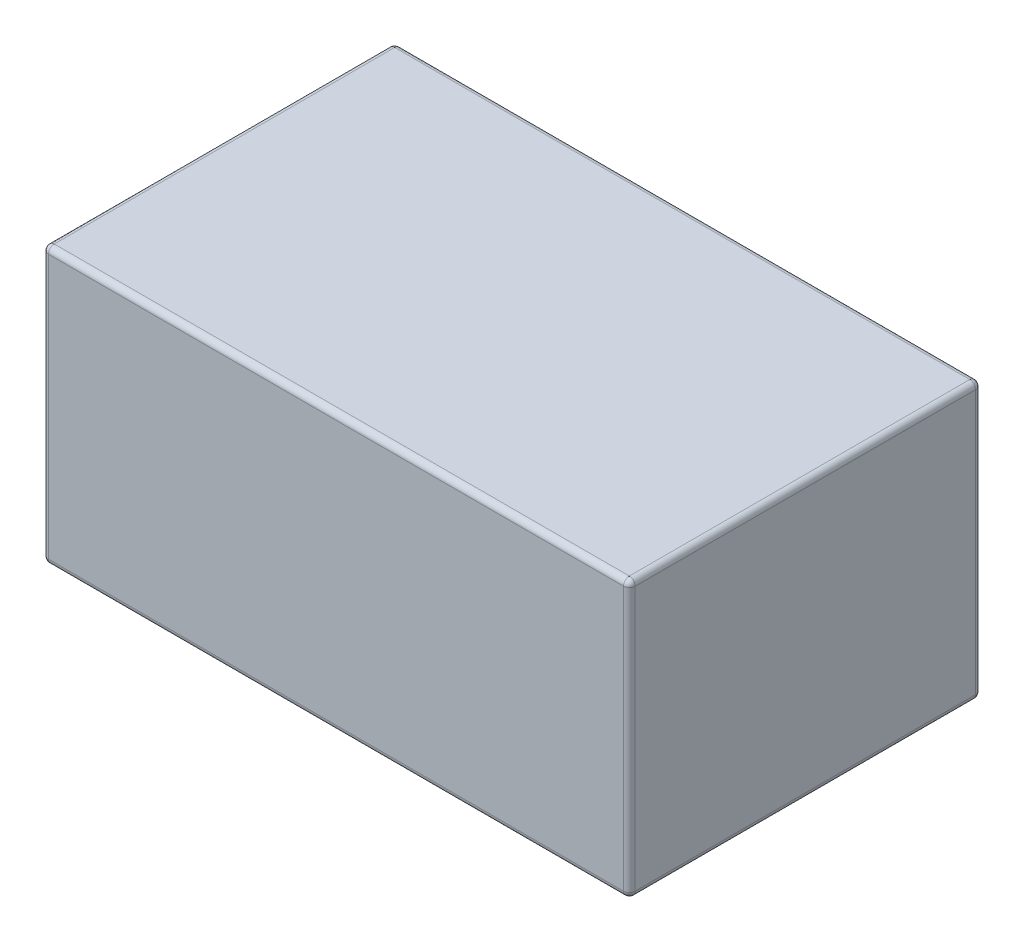
ISO-10303-21;
HEADER;
FILE_DESCRIPTION(('STEP AP214'),'2;1');
FILE_NAME('part.step','',(''),(''),'','','');
FILE_SCHEMA(('AUTOMOTIVE_DESIGN { 1 0 10303 214 1 1 1 1 }'));
ENDSEC;
DATA;
#1=APPLICATION_CONTEXT('core data for automotive mechanical design processes');
#2=APPLICATION_PROTOCOL_DEFINITION('international standard','automotive_design',2000,#1);
#3=PRODUCT_CONTEXT('',#1,'mechanical');
#4=PRODUCT('Part','Part','',(#3));
#5=PRODUCT_RELATED_PRODUCT_CATEGORY('part','',(#4));
#6=PRODUCT_DEFINITION_FORMATION('','',#4);
#7=PRODUCT_DEFINITION_CONTEXT('part definition',#1,'design');
#8=PRODUCT_DEFINITION('design','',#6,#7);
#9=PRODUCT_DEFINITION_SHAPE('','',#8);
#10=(LENGTH_UNIT() NAMED_UNIT(*) SI_UNIT(.MILLI.,.METRE.));
#11=(NAMED_UNIT(*) PLANE_ANGLE_UNIT() SI_UNIT($,.RADIAN.));
#12=(NAMED_UNIT(*) SI_UNIT($,.STERADIAN.) SOLID_ANGLE_UNIT());
#13=UNCERTAINTY_MEASURE_WITH_UNIT(LENGTH_MEASURE(1.E-05),#10,'distance_accuracy_value','');
#14=(GEOMETRIC_REPRESENTATION_CONTEXT(3) GLOBAL_UNCERTAINTY_ASSIGNED_CONTEXT((#13)) GLOBAL_UNIT_ASSIGNED_CONTEXT((#10,
#11,#12)) REPRESENTATION_CONTEXT('',''));
#15=CARTESIAN_POINT('',(0.,0.,0.));
#16=DIRECTION('',(0.,0.,1.));
#17=DIRECTION('',(1.,0.,0.));
#18=AXIS2_PLACEMENT_3D('',#15,#16,#17);
#19=CARTESIAN_POINT('',(-3.6529,3.4756,-3.1290000000001));
#20=DIRECTION('',(-1.,0.,0.));
#21=DIRECTION('',(0.,0.,1.));
#22=AXIS2_PLACEMENT_3D('',#19,#20,#21);
#23=PLANE('',#22);
#24=DIRECTION('',(0.,1.,0.));
#25=VECTOR('',#24,1.);
#26=CARTESIAN_POINT('',(-3.6529,3.4756,-3.7190000000001));
#27=LINE('',#26,#25);
#28=CARTESIAN_POINT('',(-3.6529,3.0156,-3.7190000000001));
#29=VERTEX_POINT('',#28);
#30=CARTESIAN_POINT('',(-3.6529,3.4656,-3.7190000000001));
#31=VERTEX_POINT('',#30);
#32=EDGE_CURVE('E11',#29,#31,#27,.T.);
#33=ORIENTED_EDGE('',*,*,#32,.T.);
#34=DIRECTION('',(0.,0.,1.));
#35=VECTOR('',#34,1.);
#36=CARTESIAN_POINT('',(-3.6529,3.4656,-3.1290000000001));
#37=LINE('',#36,#35);
#38=CARTESIAN_POINT('',(-3.6529,3.4656,-3.1390000000001));
#39=VERTEX_POINT('',#38);
#40=EDGE_CURVE('E24',#31,#39,#37,.T.);
#41=ORIENTED_EDGE('',*,*,#40,.T.);
#42=DIRECTION('',(0.,-1.,0.));
#43=VECTOR('',#42,1.);
#44=CARTESIAN_POINT('',(-3.6529,3.4756,-3.1390000000001));
#45=LINE('',#44,#43);
#46=CARTESIAN_POINT('',(-3.6529,3.0156,-3.1390000000001));
#47=VERTEX_POINT('',#46);
#48=EDGE_CURVE('E226',#39,#47,#45,.T.);
#49=ORIENTED_EDGE('',*,*,#48,.T.);
#50=DIRECTION('',(0.,0.,-1.));
#51=VECTOR('',#50,1.);
#52=CARTESIAN_POINT('',(-3.6529,3.0156,-3.7290000000001));
#53=LINE('',#52,#51);
#54=EDGE_CURVE('E137',#47,#29,#53,.T.);
#55=ORIENTED_EDGE('',*,*,#54,.T.);
#56=EDGE_LOOP('',(#33,#41,#49,#55));
#57=FACE_BOUND('',#56,.T.);
#58=ADVANCED_FACE('F17',(#57),#23,.F.);
#59=CARTESIAN_POINT('',(-4.6529,3.4756,-3.7290000000001));
#60=DIRECTION('',(0.,0.,1.));
#61=DIRECTION('',(1.,0.,0.));
#62=AXIS2_PLACEMENT_3D('',#59,#60,#61);
#63=PLANE('',#62);
#64=DIRECTION('',(0.,1.,0.));
#65=VECTOR('',#64,1.);
#66=CARTESIAN_POINT('',(-4.6429,3.4756,-3.7290000000001));
#67=LINE('',#66,#65);
#68=CARTESIAN_POINT('',(-4.6429,3.0156,-3.7290000000001));
#69=VERTEX_POINT('',#68);
#70=CARTESIAN_POINT('',(-4.6429,3.4656,-3.7290000000001));
#71=VERTEX_POINT('',#70);
#72=EDGE_CURVE('E223',#69,#71,#67,.T.);
#73=ORIENTED_EDGE('',*,*,#72,.T.);
#74=DIRECTION('',(1.,0.,0.));
#75=VECTOR('',#74,1.);
#76=CARTESIAN_POINT('',(-4.6529,3.4656,-3.7290000000001));
#77=LINE('',#76,#75);
#78=CARTESIAN_POINT('',(-3.6629,3.4656,-3.7290000000001));
#79=VERTEX_POINT('',#78);
#80=EDGE_CURVE('E221',#71,#79,#77,.T.);
#81=ORIENTED_EDGE('',*,*,#80,.T.);
#82=DIRECTION('',(0.,-1.,0.));
#83=VECTOR('',#82,1.);
#84=CARTESIAN_POINT('',(-3.6629,3.4756,-3.7290000000001));
#85=LINE('',#84,#83);
#86=CARTESIAN_POINT('',(-3.6629,3.0156,-3.7290000000001));
#87=VERTEX_POINT('',#86);
#88=EDGE_CURVE('E219',#79,#87,#85,.T.);
#89=ORIENTED_EDGE('',*,*,#88,.T.);
#90=DIRECTION('',(-1.,0.,0.));
#91=VECTOR('',#90,1.);
#92=CARTESIAN_POINT('',(-4.6529,3.0156,-3.7290000000001));
#93=LINE('',#92,#91);
#94=EDGE_CURVE('E216',#87,#69,#93,.T.);
#95=ORIENTED_EDGE('',*,*,#94,.T.);
#96=EDGE_LOOP('',(#73,#81,#89,#95));
#97=FACE_BOUND('',#96,.T.);
#98=ADVANCED_FACE('F288',(#97),#63,.F.);
#99=CARTESIAN_POINT('',(-4.6529,3.4756,-3.1290000000001));
#100=DIRECTION('',(1.,0.,0.));
#101=DIRECTION('',(0.,0.,-1.));
#102=AXIS2_PLACEMENT_3D('',#99,#100,#101);
#103=PLANE('',#102);
#104=DIRECTION('',(0.,1.,0.));
#105=VECTOR('',#104,1.);
#106=CARTESIAN_POINT('',(-4.6529,3.4756,-3.1390000000001));
#107=LINE('',#106,#105);
#108=CARTESIAN_POINT('',(-4.6529,3.0156,-3.1390000000001));
#109=VERTEX_POINT('',#108);
#110=CARTESIAN_POINT('',(-4.6529,3.4656,-3.1390000000001));
#111=VERTEX_POINT('',#110);
#112=EDGE_CURVE('E214',#109,#111,#107,.T.);
#113=ORIENTED_EDGE('',*,*,#112,.T.);
#114=DIRECTION('',(0.,0.,-1.));
#115=VECTOR('',#114,1.);
#116=CARTESIAN_POINT('',(-4.6529,3.4656,-3.1290000000001));
#117=LINE('',#116,#115);
#118=CARTESIAN_POINT('',(-4.6529,3.4656,-3.7190000000001));
#119=VERTEX_POINT('',#118);
#120=EDGE_CURVE('E212',#111,#119,#117,.T.);
#121=ORIENTED_EDGE('',*,*,#120,.T.);
#122=DIRECTION('',(0.,-1.,0.));
#123=VECTOR('',#122,1.);
#124=CARTESIAN_POINT('',(-4.6529,3.4756,-3.7190000000001));
#125=LINE('',#124,#123);
#126=CARTESIAN_POINT('',(-4.6529,3.0156,-3.7190000000001));
#127=VERTEX_POINT('',#126);
#128=EDGE_CURVE('E210',#119,#127,#125,.T.);
#129=ORIENTED_EDGE('',*,*,#128,.T.);
#130=DIRECTION('',(0.,0.,1.));
#131=VECTOR('',#130,1.);
#132=CARTESIAN_POINT('',(-4.6529,3.0156,-3.1290000000001));
#133=LINE('',#132,#131);
#134=EDGE_CURVE('E207',#127,#109,#133,.T.);
#135=ORIENTED_EDGE('',*,*,#134,.T.);
#136=EDGE_LOOP('',(#113,#121,#129,#135));
#137=FACE_BOUND('',#136,.T.);
#138=ADVANCED_FACE('F263',(#137),#103,.F.);
#139=CARTESIAN_POINT('',(-4.6529,3.4756,-3.1290000000001));
#140=DIRECTION('',(0.,0.,-1.));
#141=DIRECTION('',(-1.,0.,0.));
#142=AXIS2_PLACEMENT_3D('',#139,#140,#141);
#143=PLANE('',#142);
#144=DIRECTION('',(0.,1.,0.));
#145=VECTOR('',#144,1.);
#146=CARTESIAN_POINT('',(-3.6629,3.4756,-3.1290000000001));
#147=LINE('',#146,#145);
#148=CARTESIAN_POINT('',(-3.6629,3.0156,-3.1290000000001));
#149=VERTEX_POINT('',#148);
#150=CARTESIAN_POINT('',(-3.6629,3.4656,-3.1290000000001));
#151=VERTEX_POINT('',#150);
#152=EDGE_CURVE('E205',#149,#151,#147,.T.);
#153=ORIENTED_EDGE('',*,*,#152,.T.);
#154=DIRECTION('',(-1.,0.,0.));
#155=VECTOR('',#154,1.);
#156=CARTESIAN_POINT('',(-4.6529,3.4656,-3.1290000000001));
#157=LINE('',#156,#155);
#158=CARTESIAN_POINT('',(-4.6429,3.4656,-3.1290000000001));
#159=VERTEX_POINT('',#158);
#160=EDGE_CURVE('E203',#151,#159,#157,.T.);
#161=ORIENTED_EDGE('',*,*,#160,.T.);
#162=DIRECTION('',(0.,-1.,0.));
#163=VECTOR('',#162,1.);
#164=CARTESIAN_POINT('',(-4.6429,3.4756,-3.1290000000001));
#165=LINE('',#164,#163);
#166=CARTESIAN_POINT('',(-4.6429,3.0156,-3.1290000000001));
#167=VERTEX_POINT('',#166);
#168=EDGE_CURVE('E201',#159,#167,#165,.T.);
#169=ORIENTED_EDGE('',*,*,#168,.T.);
#170=DIRECTION('',(1.,0.,0.));
#171=VECTOR('',#170,1.);
#172=CARTESIAN_POINT('',(-3.6529,3.0156,-3.1290000000001));
#173=LINE('',#172,#171);
#174=EDGE_CURVE('E198',#167,#149,#173,.T.);
#175=ORIENTED_EDGE('',*,*,#174,.T.);
#176=EDGE_LOOP('',(#153,#161,#169,#175));
#177=FACE_BOUND('',#176,.T.);
#178=ADVANCED_FACE('F249',(#177),#143,.F.);
#179=CARTESIAN_POINT('',(-4.1529,3.4756,-3.4290000000001));
#180=DIRECTION('',(0.,-1.,0.));
#181=DIRECTION('',(0.,0.,-1.));
#182=AXIS2_PLACEMENT_3D('',#179,#180,#181);
#183=PLANE('',#182);
#184=DIRECTION('',(0.,0.,1.));
#185=VECTOR('',#184,1.);
#186=CARTESIAN_POINT('',(-4.6429,3.4756,-3.4290000000001));
#187=LINE('',#186,#185);
#188=CARTESIAN_POINT('',(-4.6429,3.4756,-3.7190000000001));
#189=VERTEX_POINT('',#188);
#190=CARTESIAN_POINT('',(-4.6429,3.4756,-3.1390000000001));
#191=VERTEX_POINT('',#190);
#192=EDGE_CURVE('E196',#189,#191,#187,.T.);
#193=ORIENTED_EDGE('',*,*,#192,.T.);
#194=DIRECTION('',(1.,0.,0.));
#195=VECTOR('',#194,1.);
#196=CARTESIAN_POINT('',(-4.1529,3.4756,-3.1390000000001));
#197=LINE('',#196,#195);
#198=CARTESIAN_POINT('',(-3.6629,3.4756,-3.1390000000001));
#199=VERTEX_POINT('',#198);
#200=EDGE_CURVE('E194',#191,#199,#197,.T.);
#201=ORIENTED_EDGE('',*,*,#200,.T.);
#202=DIRECTION('',(0.,0.,-1.));
#203=VECTOR('',#202,1.);
#204=CARTESIAN_POINT('',(-3.6629,3.4756,-3.4290000000001));
#205=LINE('',#204,#203);
#206=CARTESIAN_POINT('',(-3.6629,3.4756,-3.7190000000001));
#207=VERTEX_POINT('',#206);
#208=EDGE_CURVE('E192',#199,#207,#205,.T.);
#209=ORIENTED_EDGE('',*,*,#208,.T.);
#210=DIRECTION('',(-1.,0.,0.));
#211=VECTOR('',#210,1.);
#212=CARTESIAN_POINT('',(-4.1529,3.4756,-3.7190000000001));
#213=LINE('',#212,#211);
#214=EDGE_CURVE('E189',#207,#189,#213,.T.);
#215=ORIENTED_EDGE('',*,*,#214,.T.);
#216=EDGE_LOOP('',(#193,#201,#209,#215));
#217=FACE_BOUND('',#216,.T.);
#218=ADVANCED_FACE('F300',(#217),#183,.F.);
#219=CARTESIAN_POINT('',(-4.1529,3.0056,-3.4290000000001));
#220=DIRECTION('',(0.,-1.,0.));
#221=DIRECTION('',(0.,0.,-1.));
#222=AXIS2_PLACEMENT_3D('',#219,#220,#221);
#223=PLANE('',#222);
#224=DIRECTION('',(0.,0.,-1.));
#225=VECTOR('',#224,1.);
#226=CARTESIAN_POINT('',(-4.6429,3.0056,-3.7290000000001));
#227=LINE('',#226,#225);
#228=CARTESIAN_POINT('',(-4.6429,3.0056,-3.1390000000001));
#229=VERTEX_POINT('',#228);
#230=CARTESIAN_POINT('',(-4.6429,3.0056,-3.7190000000001));
#231=VERTEX_POINT('',#230);
#232=EDGE_CURVE('E187',#229,#231,#227,.T.);
#233=ORIENTED_EDGE('',*,*,#232,.T.);
#234=DIRECTION('',(1.,0.,0.));
#235=VECTOR('',#234,1.);
#236=CARTESIAN_POINT('',(-3.6529,3.0056,-3.7190000000001));
#237=LINE('',#236,#235);
#238=CARTESIAN_POINT('',(-3.6629,3.0056,-3.7190000000001));
#239=VERTEX_POINT('',#238);
#240=EDGE_CURVE('E108',#231,#239,#237,.T.);
#241=ORIENTED_EDGE('',*,*,#240,.T.);
#242=DIRECTION('',(0.,0.,1.));
#243=VECTOR('',#242,1.);
#244=CARTESIAN_POINT('',(-3.6629,3.0056,-3.1290000000001));
#245=LINE('',#244,#243);
#246=CARTESIAN_POINT('',(-3.6629,3.0056,-3.1390000000001));
#247=VERTEX_POINT('',#246);
#248=EDGE_CURVE('E102',#239,#247,#245,.T.);
#249=ORIENTED_EDGE('',*,*,#248,.T.);
#250=DIRECTION('',(-1.,0.,0.));
#251=VECTOR('',#250,1.);
#252=CARTESIAN_POINT('',(-4.6529,3.0056,-3.1390000000001));
#253=LINE('',#252,#251);
#254=EDGE_CURVE('E105',#247,#229,#253,.T.);
#255=ORIENTED_EDGE('',*,*,#254,.T.);
#256=EDGE_LOOP('',(#233,#241,#249,#255));
#257=FACE_BOUND('',#256,.T.);
#258=ADVANCED_FACE('F104',(#257),#223,.T.);
#259=CARTESIAN_POINT('',(-4.6429,3.4756,-3.1390000000001));
#260=DIRECTION('',(0.,-1.,0.));
#261=DIRECTION('',(0.,0.,-1.));
#262=AXIS2_PLACEMENT_3D('',#259,#260,#261);
#263=CYLINDRICAL_SURFACE('',#262,0.01);
#264=CARTESIAN_POINT('',(-4.6429,3.4656,-3.1390000000001));
#265=DIRECTION('',(0.,1.,0.));
#266=DIRECTION('',(0.,0.,1.));
#267=AXIS2_PLACEMENT_3D('',#264,#265,#266);
#268=CIRCLE('',#267,0.01);
#269=EDGE_CURVE('E124',#111,#159,#268,.T.);
#270=ORIENTED_EDGE('',*,*,#269,.F.);
#271=ORIENTED_EDGE('',*,*,#112,.F.);
#272=CARTESIAN_POINT('',(-4.6429,3.0156,-3.1390000000001));
#273=DIRECTION('',(0.,-1.,0.));
#274=DIRECTION('',(0.,0.,-1.));
#275=AXIS2_PLACEMENT_3D('',#272,#273,#274);
#276=CIRCLE('',#275,0.01);
#277=EDGE_CURVE('E181',#167,#109,#276,.T.);
#278=ORIENTED_EDGE('',*,*,#277,.F.);
#279=ORIENTED_EDGE('',*,*,#168,.F.);
#280=EDGE_LOOP('',(#270,#271,#278,#279));
#281=FACE_BOUND('',#280,.T.);
#282=ADVANCED_FACE('F253',(#281),#263,.T.);
#283=CARTESIAN_POINT('',(-4.6429,3.4656,-3.1390000000001));
#284=DIRECTION('',(0.,1.,0.));
#285=DIRECTION('',(1.,0.,0.));
#286=AXIS2_PLACEMENT_3D('',#283,#284,#285);
#287=SPHERICAL_SURFACE('',#286,0.01);
#288=CARTESIAN_POINT('',(-4.6429,3.4656,-3.1390000000001));
#289=DIRECTION('',(0.,0.,-1.));
#290=DIRECTION('',(1.,0.,0.));
#291=AXIS2_PLACEMENT_3D('',#288,#289,#290);
#292=CIRCLE('',#291,0.00999999999999959);
#293=EDGE_CURVE('E178',#111,#191,#292,.T.);
#294=ORIENTED_EDGE('',*,*,#293,.F.);
#295=ORIENTED_EDGE('',*,*,#269,.T.);
#296=CARTESIAN_POINT('',(-4.6429,3.4656,-3.1390000000001));
#297=DIRECTION('',(1.,0.,0.));
#298=DIRECTION('',(0.,0.,1.));
#299=AXIS2_PLACEMENT_3D('',#296,#297,#298);
#300=CIRCLE('',#299,0.01);
#301=EDGE_CURVE('E175',#191,#159,#300,.T.);
#302=ORIENTED_EDGE('',*,*,#301,.F.);
#303=EDGE_LOOP('',(#294,#295,#302));
#304=FACE_BOUND('',#303,.T.);
#305=ADVANCED_FACE('F256',(#304),#287,.T.);
#306=CARTESIAN_POINT('',(-4.6429,3.0156,-3.1390000000001));
#307=DIRECTION('',(0.,1.,0.));
#308=DIRECTION('',(1.,0.,0.));
#309=AXIS2_PLACEMENT_3D('',#306,#307,#308);
#310=SPHERICAL_SURFACE('',#309,0.01);
#311=CARTESIAN_POINT('',(-4.6429,3.0156,-3.1390000000001));
#312=DIRECTION('',(1.,0.,0.));
#313=DIRECTION('',(0.,0.,1.));
#314=AXIS2_PLACEMENT_3D('',#311,#312,#313);
#315=CIRCLE('',#314,0.01);
#316=EDGE_CURVE('E122',#167,#229,#315,.T.);
#317=ORIENTED_EDGE('',*,*,#316,.F.);
#318=ORIENTED_EDGE('',*,*,#277,.T.);
#319=CARTESIAN_POINT('',(-4.6429,3.0156,-3.1390000000001));
#320=DIRECTION('',(0.,0.,-1.));
#321=DIRECTION('',(1.,0.,0.));
#322=AXIS2_PLACEMENT_3D('',#319,#320,#321);
#323=CIRCLE('',#322,0.00999999999999959);
#324=EDGE_CURVE('E171',#229,#109,#323,.T.);
#325=ORIENTED_EDGE('',*,*,#324,.F.);
#326=EDGE_LOOP('',(#317,#318,#325));
#327=FACE_BOUND('',#326,.T.);
#328=ADVANCED_FACE('F277',(#327),#310,.T.);
#329=CARTESIAN_POINT('',(-4.1529,3.4656,-3.1390000000001));
#330=DIRECTION('',(1.,0.,0.));
#331=DIRECTION('',(0.,0.,-1.));
#332=AXIS2_PLACEMENT_3D('',#329,#330,#331);
#333=CYLINDRICAL_SURFACE('',#332,0.01);
#334=ORIENTED_EDGE('',*,*,#301,.T.);
#335=ORIENTED_EDGE('',*,*,#160,.F.);
#336=CARTESIAN_POINT('',(-3.6629,3.4656,-3.1390000000001));
#337=DIRECTION('',(1.,0.,0.));
#338=DIRECTION('',(0.,0.,-1.));
#339=AXIS2_PLACEMENT_3D('',#336,#337,#338);
#340=CIRCLE('',#339,0.01);
#341=EDGE_CURVE('E168',#199,#151,#340,.T.);
#342=ORIENTED_EDGE('',*,*,#341,.F.);
#343=ORIENTED_EDGE('',*,*,#200,.F.);
#344=EDGE_LOOP('',(#334,#335,#342,#343));
#345=FACE_BOUND('',#344,.T.);
#346=ADVANCED_FACE('F245',(#345),#333,.T.);
#347=CARTESIAN_POINT('',(-4.6429,3.4656,-3.4290000000001));
#348=DIRECTION('',(0.,0.,1.));
#349=DIRECTION('',(1.,0.,0.));
#350=AXIS2_PLACEMENT_3D('',#347,#348,#349);
#351=CYLINDRICAL_SURFACE('',#350,0.00999999999999959);
#352=ORIENTED_EDGE('',*,*,#293,.T.);
#353=ORIENTED_EDGE('',*,*,#192,.F.);
#354=CARTESIAN_POINT('',(-4.6429,3.4656,-3.7190000000001));
#355=DIRECTION('',(0.,0.,-1.));
#356=DIRECTION('',(-1.,0.,0.));
#357=AXIS2_PLACEMENT_3D('',#354,#355,#356);
#358=CIRCLE('',#357,0.00999999999999959);
#359=EDGE_CURVE('E165',#119,#189,#358,.T.);
#360=ORIENTED_EDGE('',*,*,#359,.F.);
#361=ORIENTED_EDGE('',*,*,#120,.F.);
#362=EDGE_LOOP('',(#352,#353,#360,#361));
#363=FACE_BOUND('',#362,.T.);
#364=ADVANCED_FACE('F259',(#363),#351,.T.);
#365=CARTESIAN_POINT('',(-4.6429,3.4756,-3.7190000000001));
#366=DIRECTION('',(0.,-1.,0.));
#367=DIRECTION('',(0.,0.,-1.));
#368=AXIS2_PLACEMENT_3D('',#365,#366,#367);
#369=CYLINDRICAL_SURFACE('',#368,0.01);
#370=CARTESIAN_POINT('',(-4.6429,3.0156,-3.7190000000001));
#371=DIRECTION('',(0.,-1.,0.));
#372=DIRECTION('',(0.,0.,-1.));
#373=AXIS2_PLACEMENT_3D('',#370,#371,#372);
#374=CIRCLE('',#373,0.01);
#375=EDGE_CURVE('E162',#127,#69,#374,.T.);
#376=ORIENTED_EDGE('',*,*,#375,.F.);
#377=ORIENTED_EDGE('',*,*,#128,.F.);
#378=CARTESIAN_POINT('',(-4.6429,3.4656,-3.7190000000001));
#379=DIRECTION('',(0.,1.,0.));
#380=DIRECTION('',(0.,0.,1.));
#381=AXIS2_PLACEMENT_3D('',#378,#379,#380);
#382=CIRCLE('',#381,0.01);
#383=EDGE_CURVE('E159',#71,#119,#382,.T.);
#384=ORIENTED_EDGE('',*,*,#383,.F.);
#385=ORIENTED_EDGE('',*,*,#72,.F.);
#386=EDGE_LOOP('',(#376,#377,#384,#385));
#387=FACE_BOUND('',#386,.T.);
#388=ADVANCED_FACE('F268',(#387),#369,.T.);
#389=CARTESIAN_POINT('',(-4.6429,3.0156,-3.1290000000001));
#390=DIRECTION('',(0.,0.,-1.));
#391=DIRECTION('',(-1.,0.,0.));
#392=AXIS2_PLACEMENT_3D('',#389,#390,#391);
#393=CYLINDRICAL_SURFACE('',#392,0.00999999999999959);
#394=ORIENTED_EDGE('',*,*,#324,.T.);
#395=ORIENTED_EDGE('',*,*,#134,.F.);
#396=CARTESIAN_POINT('',(-4.6429,3.0156,-3.7190000000001));
#397=DIRECTION('',(0.,0.,-1.));
#398=DIRECTION('',(-1.,0.,0.));
#399=AXIS2_PLACEMENT_3D('',#396,#397,#398);
#400=CIRCLE('',#399,0.00999999999999959);
#401=EDGE_CURVE('E132',#231,#127,#400,.T.);
#402=ORIENTED_EDGE('',*,*,#401,.F.);
#403=ORIENTED_EDGE('',*,*,#232,.F.);
#404=EDGE_LOOP('',(#394,#395,#402,#403));
#405=FACE_BOUND('',#404,.T.);
#406=ADVANCED_FACE('F275',(#405),#393,.T.);
#407=CARTESIAN_POINT('',(-4.6529,3.0156,-3.1390000000001));
#408=DIRECTION('',(-1.,0.,0.));
#409=DIRECTION('',(0.,0.,1.));
#410=AXIS2_PLACEMENT_3D('',#407,#408,#409);
#411=CYLINDRICAL_SURFACE('',#410,0.01);
#412=ORIENTED_EDGE('',*,*,#316,.T.);
#413=ORIENTED_EDGE('',*,*,#254,.F.);
#414=CARTESIAN_POINT('',(-3.6629,3.0156,-3.1390000000001));
#415=DIRECTION('',(1.,0.,0.));
#416=DIRECTION('',(0.,0.,-1.));
#417=AXIS2_PLACEMENT_3D('',#414,#415,#416);
#418=CIRCLE('',#417,0.01);
#419=EDGE_CURVE('E119',#149,#247,#418,.T.);
#420=ORIENTED_EDGE('',*,*,#419,.F.);
#421=ORIENTED_EDGE('',*,*,#174,.F.);
#422=EDGE_LOOP('',(#412,#413,#420,#421));
#423=FACE_BOUND('',#422,.T.);
#424=ADVANCED_FACE('F117',(#423),#411,.T.);
#425=CARTESIAN_POINT('',(-3.6629,3.4756,-3.1390000000001));
#426=DIRECTION('',(0.,-1.,0.));
#427=DIRECTION('',(0.,0.,-1.));
#428=AXIS2_PLACEMENT_3D('',#425,#426,#427);
#429=CYLINDRICAL_SURFACE('',#428,0.01);
#430=CARTESIAN_POINT('',(-3.6629,3.4656,-3.1390000000001));
#431=DIRECTION('',(0.,1.,0.));
#432=DIRECTION('',(0.,0.,1.));
#433=AXIS2_PLACEMENT_3D('',#430,#431,#432);
#434=CIRCLE('',#433,0.01);
#435=EDGE_CURVE('E133',#151,#39,#434,.T.);
#436=ORIENTED_EDGE('',*,*,#435,.F.);
#437=ORIENTED_EDGE('',*,*,#152,.F.);
#438=CARTESIAN_POINT('',(-3.6629,3.0156,-3.1390000000001));
#439=DIRECTION('',(0.,-1.,0.));
#440=DIRECTION('',(0.,0.,-1.));
#441=AXIS2_PLACEMENT_3D('',#438,#439,#440);
#442=CIRCLE('',#441,0.01);
#443=EDGE_CURVE('E131',#47,#149,#442,.T.);
#444=ORIENTED_EDGE('',*,*,#443,.F.);
#445=ORIENTED_EDGE('',*,*,#48,.F.);
#446=EDGE_LOOP('',(#436,#437,#444,#445));
#447=FACE_BOUND('',#446,.T.);
#448=ADVANCED_FACE('F232',(#447),#429,.T.);
#449=CARTESIAN_POINT('',(-3.6629,3.4656,-3.1390000000001));
#450=DIRECTION('',(0.,1.,0.));
#451=DIRECTION('',(1.,0.,0.));
#452=AXIS2_PLACEMENT_3D('',#449,#450,#451);
#453=SPHERICAL_SURFACE('',#452,0.01);
#454=ORIENTED_EDGE('',*,*,#341,.T.);
#455=ORIENTED_EDGE('',*,*,#435,.T.);
#456=CARTESIAN_POINT('',(-3.6629,3.4656,-3.1390000000001));
#457=DIRECTION('',(0.,0.,-1.));
#458=DIRECTION('',(1.,0.,0.));
#459=AXIS2_PLACEMENT_3D('',#456,#457,#458);
#460=CIRCLE('',#459,0.01);
#461=EDGE_CURVE('E151',#199,#39,#460,.T.);
#462=ORIENTED_EDGE('',*,*,#461,.F.);
#463=EDGE_LOOP('',(#454,#455,#462));
#464=FACE_BOUND('',#463,.T.);
#465=ADVANCED_FACE('F235',(#464),#453,.T.);
#466=CARTESIAN_POINT('',(-4.6429,3.4656,-3.7190000000001));
#467=DIRECTION('',(0.,1.,0.));
#468=DIRECTION('',(1.,0.,0.));
#469=AXIS2_PLACEMENT_3D('',#466,#467,#468);
#470=SPHERICAL_SURFACE('',#469,0.01);
#471=ORIENTED_EDGE('',*,*,#383,.T.);
#472=ORIENTED_EDGE('',*,*,#359,.T.);
#473=CARTESIAN_POINT('',(-4.6429,3.4656,-3.7190000000001));
#474=DIRECTION('',(1.,0.,0.));
#475=DIRECTION('',(0.,0.,1.));
#476=AXIS2_PLACEMENT_3D('',#473,#474,#475);
#477=CIRCLE('',#476,0.01);
#478=EDGE_CURVE('E142',#71,#189,#477,.T.);
#479=ORIENTED_EDGE('',*,*,#478,.F.);
#480=EDGE_LOOP('',(#471,#472,#479));
#481=FACE_BOUND('',#480,.T.);
#482=ADVANCED_FACE('F381',(#481),#470,.T.);
#483=CARTESIAN_POINT('',(-4.6429,3.0156,-3.7190000000001));
#484=DIRECTION('',(0.,1.,0.));
#485=DIRECTION('',(1.,0.,0.));
#486=AXIS2_PLACEMENT_3D('',#483,#484,#485);
#487=SPHERICAL_SURFACE('',#486,0.01);
#488=ORIENTED_EDGE('',*,*,#401,.T.);
#489=ORIENTED_EDGE('',*,*,#375,.T.);
#490=CARTESIAN_POINT('',(-4.6429,3.0156,-3.7190000000001));
#491=DIRECTION('',(1.,0.,0.));
#492=DIRECTION('',(0.,0.,1.));
#493=AXIS2_PLACEMENT_3D('',#490,#491,#492);
#494=CIRCLE('',#493,0.01);
#495=EDGE_CURVE('E138',#231,#69,#494,.T.);
#496=ORIENTED_EDGE('',*,*,#495,.F.);
#497=EDGE_LOOP('',(#488,#489,#496));
#498=FACE_BOUND('',#497,.T.);
#499=ADVANCED_FACE('F273',(#498),#487,.T.);
#500=CARTESIAN_POINT('',(-3.6629,3.0156,-3.1390000000001));
#501=DIRECTION('',(0.,1.,0.));
#502=DIRECTION('',(1.,0.,0.));
#503=AXIS2_PLACEMENT_3D('',#500,#501,#502);
#504=SPHERICAL_SURFACE('',#503,0.01);
#505=ORIENTED_EDGE('',*,*,#443,.T.);
#506=ORIENTED_EDGE('',*,*,#419,.T.);
#507=CARTESIAN_POINT('',(-3.6629,3.0156,-3.1390000000001));
#508=DIRECTION('',(0.,0.,-1.));
#509=DIRECTION('',(1.,0.,0.));
#510=AXIS2_PLACEMENT_3D('',#507,#508,#509);
#511=CIRCLE('',#510,0.01);
#512=EDGE_CURVE('E129',#47,#247,#511,.T.);
#513=ORIENTED_EDGE('',*,*,#512,.F.);
#514=EDGE_LOOP('',(#505,#506,#513));
#515=FACE_BOUND('',#514,.T.);
#516=ADVANCED_FACE('F128',(#515),#504,.T.);
#517=CARTESIAN_POINT('',(-3.6629,3.4656,-3.4290000000001));
#518=DIRECTION('',(0.,0.,-1.));
#519=DIRECTION('',(-1.,0.,0.));
#520=AXIS2_PLACEMENT_3D('',#517,#518,#519);
#521=CYLINDRICAL_SURFACE('',#520,0.01);
#522=ORIENTED_EDGE('',*,*,#461,.T.);
#523=ORIENTED_EDGE('',*,*,#40,.F.);
#524=CARTESIAN_POINT('',(-3.6629,3.4656,-3.7190000000001));
#525=DIRECTION('',(0.,0.,-1.));
#526=DIRECTION('',(-1.,0.,0.));
#527=AXIS2_PLACEMENT_3D('',#524,#525,#526);
#528=CIRCLE('',#527,0.01);
#529=EDGE_CURVE('E139',#207,#31,#528,.T.);
#530=ORIENTED_EDGE('',*,*,#529,.F.);
#531=ORIENTED_EDGE('',*,*,#208,.F.);
#532=EDGE_LOOP('',(#522,#523,#530,#531));
#533=FACE_BOUND('',#532,.T.);
#534=ADVANCED_FACE('F238',(#533),#521,.T.);
#535=CARTESIAN_POINT('',(-4.1529,3.4656,-3.7190000000001));
#536=DIRECTION('',(-1.,0.,0.));
#537=DIRECTION('',(0.,0.,1.));
#538=AXIS2_PLACEMENT_3D('',#535,#536,#537);
#539=CYLINDRICAL_SURFACE('',#538,0.01);
#540=ORIENTED_EDGE('',*,*,#478,.T.);
#541=ORIENTED_EDGE('',*,*,#214,.F.);
#542=CARTESIAN_POINT('',(-3.6629,3.4656,-3.7190000000001));
#543=DIRECTION('',(1.,0.,0.));
#544=DIRECTION('',(0.,0.,-1.));
#545=AXIS2_PLACEMENT_3D('',#542,#543,#544);
#546=CIRCLE('',#545,0.01);
#547=EDGE_CURVE('E145',#79,#207,#546,.T.);
#548=ORIENTED_EDGE('',*,*,#547,.F.);
#549=ORIENTED_EDGE('',*,*,#80,.F.);
#550=EDGE_LOOP('',(#540,#541,#548,#549));
#551=FACE_BOUND('',#550,.T.);
#552=ADVANCED_FACE('F415',(#551),#539,.T.);
#553=CARTESIAN_POINT('',(-4.6529,3.0156,-3.7190000000001));
#554=DIRECTION('',(1.,0.,0.));
#555=DIRECTION('',(0.,0.,-1.));
#556=AXIS2_PLACEMENT_3D('',#553,#554,#555);
#557=CYLINDRICAL_SURFACE('',#556,0.01);
#558=ORIENTED_EDGE('',*,*,#495,.T.);
#559=ORIENTED_EDGE('',*,*,#94,.F.);
#560=CARTESIAN_POINT('',(-3.6629,3.0156,-3.7190000000001));
#561=DIRECTION('',(1.,0.,0.));
#562=DIRECTION('',(0.,0.,-1.));
#563=AXIS2_PLACEMENT_3D('',#560,#561,#562);
#564=CIRCLE('',#563,0.01);
#565=EDGE_CURVE('E483',#239,#87,#564,.T.);
#566=ORIENTED_EDGE('',*,*,#565,.F.);
#567=ORIENTED_EDGE('',*,*,#240,.F.);
#568=EDGE_LOOP('',(#558,#559,#566,#567));
#569=FACE_BOUND('',#568,.T.);
#570=ADVANCED_FACE('F424',(#569),#557,.T.);
#571=CARTESIAN_POINT('',(-3.6629,3.0156,-3.1290000000001));
#572=DIRECTION('',(0.,0.,1.));
#573=DIRECTION('',(1.,0.,0.));
#574=AXIS2_PLACEMENT_3D('',#571,#572,#573);
#575=CYLINDRICAL_SURFACE('',#574,0.01);
#576=ORIENTED_EDGE('',*,*,#512,.T.);
#577=ORIENTED_EDGE('',*,*,#248,.F.);
#578=CARTESIAN_POINT('',(-3.6629,3.0156,-3.7190000000001));
#579=DIRECTION('',(0.,0.,-1.));
#580=DIRECTION('',(-1.,0.,0.));
#581=AXIS2_PLACEMENT_3D('',#578,#579,#580);
#582=CIRCLE('',#581,0.01);
#583=EDGE_CURVE('E479',#29,#239,#582,.T.);
#584=ORIENTED_EDGE('',*,*,#583,.F.);
#585=ORIENTED_EDGE('',*,*,#54,.F.);
#586=EDGE_LOOP('',(#576,#577,#584,#585));
#587=FACE_BOUND('',#586,.T.);
#588=ADVANCED_FACE('F136',(#587),#575,.T.);
#589=CARTESIAN_POINT('',(-3.6629,3.4656,-3.7190000000001));
#590=DIRECTION('',(0.,1.,0.));
#591=DIRECTION('',(1.,0.,0.));
#592=AXIS2_PLACEMENT_3D('',#589,#590,#591);
#593=SPHERICAL_SURFACE('',#592,0.01);
#594=ORIENTED_EDGE('',*,*,#547,.T.);
#595=ORIENTED_EDGE('',*,*,#529,.T.);
#596=CARTESIAN_POINT('',(-3.6629,3.4656,-3.7190000000001));
#597=DIRECTION('',(0.,-1.,0.));
#598=DIRECTION('',(0.,0.,1.));
#599=AXIS2_PLACEMENT_3D('',#596,#597,#598);
#600=CIRCLE('',#599,0.01);
#601=EDGE_CURVE('E477',#79,#31,#600,.T.);
#602=ORIENTED_EDGE('',*,*,#601,.F.);
#603=EDGE_LOOP('',(#594,#595,#602));
#604=FACE_BOUND('',#603,.T.);
#605=ADVANCED_FACE('F443',(#604),#593,.T.);
#606=CARTESIAN_POINT('',(-3.6629,3.0156,-3.7190000000001));
#607=DIRECTION('',(0.,1.,0.));
#608=DIRECTION('',(1.,0.,0.));
#609=AXIS2_PLACEMENT_3D('',#606,#607,#608);
#610=SPHERICAL_SURFACE('',#609,0.01);
#611=ORIENTED_EDGE('',*,*,#583,.T.);
#612=ORIENTED_EDGE('',*,*,#565,.T.);
#613=CARTESIAN_POINT('',(-3.6629,3.0156,-3.7190000000001));
#614=DIRECTION('',(0.,1.,0.));
#615=DIRECTION('',(0.,0.,-1.));
#616=AXIS2_PLACEMENT_3D('',#613,#614,#615);
#617=CIRCLE('',#616,0.01);
#618=EDGE_CURVE('E480',#29,#87,#617,.T.);
#619=ORIENTED_EDGE('',*,*,#618,.F.);
#620=EDGE_LOOP('',(#611,#612,#619));
#621=FACE_BOUND('',#620,.T.);
#622=ADVANCED_FACE('F452',(#621),#610,.T.);
#623=CARTESIAN_POINT('',(-3.6629,3.4756,-3.7190000000001));
#624=DIRECTION('',(0.,-1.,0.));
#625=DIRECTION('',(0.,0.,-1.));
#626=AXIS2_PLACEMENT_3D('',#623,#624,#625);
#627=CYLINDRICAL_SURFACE('',#626,0.01);
#628=ORIENTED_EDGE('',*,*,#601,.T.);
#629=ORIENTED_EDGE('',*,*,#32,.F.);
#630=ORIENTED_EDGE('',*,*,#618,.T.);
#631=ORIENTED_EDGE('',*,*,#88,.F.);
#632=EDGE_LOOP('',(#628,#629,#630,#631));
#633=FACE_BOUND('',#632,.T.);
#634=ADVANCED_FACE('F462',(#633),#627,.T.);
#635=CLOSED_SHELL('',(#58,#98,#138,#178,#218,#258,#282,#305,#328,#346,#364,#388,#406,#424,#448,
#465,#482,#499,#516,#534,#552,#570,#588,#605,#622,#634));
#636=MANIFOLD_SOLID_BREP('B1',#635);
#637=ADVANCED_BREP_SHAPE_REPRESENTATION('',(#18,#636),#14);
#638=SHAPE_DEFINITION_REPRESENTATION(#9,#637);
ENDSEC;
END-ISO-10303-21;
